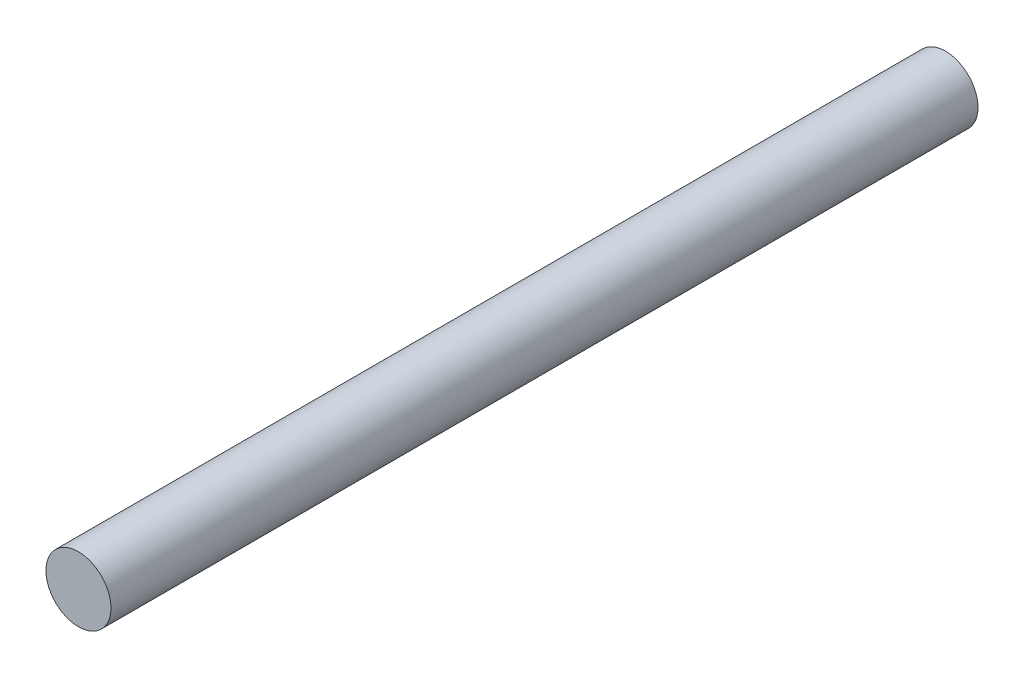
ISO-10303-21;
HEADER;
FILE_DESCRIPTION(('STEP AP214'),'2;1');
FILE_NAME('part.step','',(''),(''),'','','');
FILE_SCHEMA(('AUTOMOTIVE_DESIGN { 1 0 10303 214 1 1 1 1 }'));
ENDSEC;
DATA;
#1=APPLICATION_CONTEXT('core data for automotive mechanical design processes');
#2=APPLICATION_PROTOCOL_DEFINITION('international standard','automotive_design',2000,#1);
#3=PRODUCT_CONTEXT('',#1,'mechanical');
#4=PRODUCT('Part','Part','',(#3));
#5=PRODUCT_RELATED_PRODUCT_CATEGORY('part','',(#4));
#6=PRODUCT_DEFINITION_FORMATION('','',#4);
#7=PRODUCT_DEFINITION_CONTEXT('part definition',#1,'design');
#8=PRODUCT_DEFINITION('design','',#6,#7);
#9=PRODUCT_DEFINITION_SHAPE('','',#8);
#10=(LENGTH_UNIT() NAMED_UNIT(*) SI_UNIT(.MILLI.,.METRE.));
#11=(NAMED_UNIT(*) PLANE_ANGLE_UNIT() SI_UNIT($,.RADIAN.));
#12=(NAMED_UNIT(*) SI_UNIT($,.STERADIAN.) SOLID_ANGLE_UNIT());
#13=UNCERTAINTY_MEASURE_WITH_UNIT(LENGTH_MEASURE(1.E-05),#10,'distance_accuracy_value','');
#14=(GEOMETRIC_REPRESENTATION_CONTEXT(3) GLOBAL_UNCERTAINTY_ASSIGNED_CONTEXT((#13)) GLOBAL_UNIT_ASSIGNED_CONTEXT((#10,
#11,#12)) REPRESENTATION_CONTEXT('',''));
#15=CARTESIAN_POINT('',(0.,0.,0.));
#16=DIRECTION('',(0.,0.,1.));
#17=DIRECTION('',(1.,0.,0.));
#18=AXIS2_PLACEMENT_3D('',#15,#16,#17);
#19=CARTESIAN_POINT('',(0.,0.,200.));
#20=DIRECTION('',(0.,0.,-1.));
#21=DIRECTION('',(-1.,0.,0.));
#22=AXIS2_PLACEMENT_3D('',#19,#20,#21);
#23=CYLINDRICAL_SURFACE('',#22,7.5);
#24=CARTESIAN_POINT('',(0.,0.,200.));
#25=DIRECTION('',(0.,0.,1.));
#26=DIRECTION('',(1.,0.,0.));
#27=AXIS2_PLACEMENT_3D('',#24,#25,#26);
#28=CIRCLE('',#27,7.5);
#29=CARTESIAN_POINT('',(7.5,0.,200.));
#30=VERTEX_POINT('',#29);
#31=EDGE_CURVE('E10',#30,#30,#28,.T.);
#32=ORIENTED_EDGE('',*,*,#31,.F.);
#33=EDGE_LOOP('',(#32));
#34=FACE_BOUND('',#33,.T.);
#35=CARTESIAN_POINT('',(0.,0.,0.));
#36=DIRECTION('',(0.,0.,1.));
#37=DIRECTION('',(1.,0.,0.));
#38=AXIS2_PLACEMENT_3D('',#35,#36,#37);
#39=CIRCLE('',#38,7.5);
#40=CARTESIAN_POINT('',(7.5,0.,0.));
#41=VERTEX_POINT('',#40);
#42=EDGE_CURVE('E40',#41,#41,#39,.T.);
#43=ORIENTED_EDGE('',*,*,#42,.T.);
#44=EDGE_LOOP('',(#43));
#45=FACE_BOUND('',#44,.T.);
#46=ADVANCED_FACE('F37',(#34,#45),#23,.T.);
#47=CARTESIAN_POINT('',(0.,0.,200.));
#48=DIRECTION('',(0.,0.,1.));
#49=DIRECTION('',(1.,0.,0.));
#50=AXIS2_PLACEMENT_3D('',#47,#48,#49);
#51=PLANE('',#50);
#52=ORIENTED_EDGE('',*,*,#31,.T.);
#53=EDGE_LOOP('',(#52));
#54=FACE_BOUND('',#53,.T.);
#55=ADVANCED_FACE('F54',(#54),#51,.T.);
#56=CARTESIAN_POINT('',(0.,0.,0.));
#57=DIRECTION('',(0.,0.,1.));
#58=DIRECTION('',(1.,0.,0.));
#59=AXIS2_PLACEMENT_3D('',#56,#57,#58);
#60=PLANE('',#59);
#61=ORIENTED_EDGE('',*,*,#42,.F.);
#62=EDGE_LOOP('',(#61));
#63=FACE_BOUND('',#62,.T.);
#64=ADVANCED_FACE('F52',(#63),#60,.F.);
#65=CLOSED_SHELL('',(#46,#55,#64));
#66=MANIFOLD_SOLID_BREP('B2',#65);
#67=ADVANCED_BREP_SHAPE_REPRESENTATION('',(#18,#66),#14);
#68=SHAPE_DEFINITION_REPRESENTATION(#9,#67);
ENDSEC;
END-ISO-10303-21;
